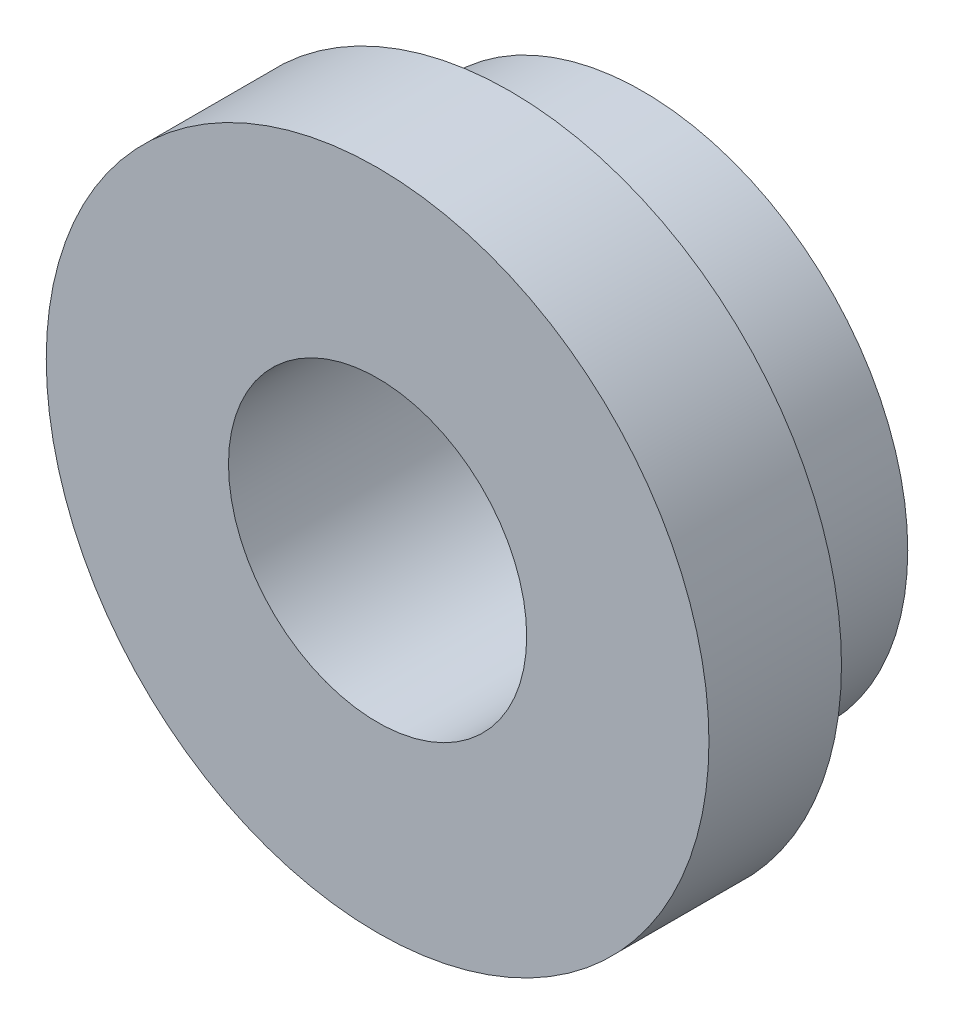
ISO-10303-21;
HEADER;
FILE_DESCRIPTION(('STEP AP214'),'2;1');
FILE_NAME('part.step','',(''),(''),'','','');
FILE_SCHEMA(('AUTOMOTIVE_DESIGN { 1 0 10303 214 1 1 1 1 }'));
ENDSEC;
DATA;
#1=APPLICATION_CONTEXT('core data for automotive mechanical design processes');
#2=APPLICATION_PROTOCOL_DEFINITION('international standard','automotive_design',2000,#1);
#3=PRODUCT_CONTEXT('',#1,'mechanical');
#4=PRODUCT('Part','Part','',(#3));
#5=PRODUCT_RELATED_PRODUCT_CATEGORY('part','',(#4));
#6=PRODUCT_DEFINITION_FORMATION('','',#4);
#7=PRODUCT_DEFINITION_CONTEXT('part definition',#1,'design');
#8=PRODUCT_DEFINITION('design','',#6,#7);
#9=PRODUCT_DEFINITION_SHAPE('','',#8);
#10=(LENGTH_UNIT() NAMED_UNIT(*) SI_UNIT(.MILLI.,.METRE.));
#11=(NAMED_UNIT(*) PLANE_ANGLE_UNIT() SI_UNIT($,.RADIAN.));
#12=(NAMED_UNIT(*) SI_UNIT($,.STERADIAN.) SOLID_ANGLE_UNIT());
#13=UNCERTAINTY_MEASURE_WITH_UNIT(LENGTH_MEASURE(1.E-05),#10,'distance_accuracy_value','');
#14=(GEOMETRIC_REPRESENTATION_CONTEXT(3) GLOBAL_UNCERTAINTY_ASSIGNED_CONTEXT((#13)) GLOBAL_UNIT_ASSIGNED_CONTEXT((#10,
#11,#12)) REPRESENTATION_CONTEXT('',''));
#15=CARTESIAN_POINT('',(0.,0.,0.));
#16=DIRECTION('',(0.,0.,1.));
#17=DIRECTION('',(1.,0.,0.));
#18=AXIS2_PLACEMENT_3D('',#15,#16,#17);
#19=CARTESIAN_POINT('',(0.,0.,0.));
#20=DIRECTION('',(0.,0.,1.));
#21=DIRECTION('',(1.,0.,0.));
#22=AXIS2_PLACEMENT_3D('',#19,#20,#21);
#23=PLANE('',#22);
#24=CARTESIAN_POINT('',(0.,0.,0.));
#25=DIRECTION('',(0.,0.,1.));
#26=DIRECTION('',(1.,0.,0.));
#27=AXIS2_PLACEMENT_3D('',#24,#25,#26);
#28=CIRCLE('',#27,4.);
#29=CARTESIAN_POINT('',(-4.,0.,0.));
#30=VERTEX_POINT('',#29);
#31=EDGE_CURVE('E34',#30,#30,#28,.T.);
#32=ORIENTED_EDGE('',*,*,#31,.F.);
#33=EDGE_LOOP('',(#32));
#34=FACE_BOUND('',#33,.T.);
#35=CARTESIAN_POINT('',(0.,0.,0.));
#36=DIRECTION('',(0.,0.,1.));
#37=DIRECTION('',(1.,0.,0.));
#38=AXIS2_PLACEMENT_3D('',#35,#36,#37);
#39=CIRCLE('',#38,2.25);
#40=CARTESIAN_POINT('',(-2.25,0.,0.));
#41=VERTEX_POINT('',#40);
#42=EDGE_CURVE('E41',#41,#41,#39,.T.);
#43=ORIENTED_EDGE('',*,*,#42,.T.);
#44=EDGE_LOOP('',(#43));
#45=FACE_BOUND('',#44,.T.);
#46=ADVANCED_FACE('F30',(#34,#45),#23,.F.);
#47=CARTESIAN_POINT('',(0.,0.,2.));
#48=DIRECTION('',(0.,0.,-1.));
#49=DIRECTION('',(-1.,0.,0.));
#50=AXIS2_PLACEMENT_3D('',#47,#48,#49);
#51=CYLINDRICAL_SURFACE('',#50,4.);
#52=CARTESIAN_POINT('',(0.,0.,2.));
#53=DIRECTION('',(0.,0.,1.));
#54=DIRECTION('',(1.,0.,0.));
#55=AXIS2_PLACEMENT_3D('',#52,#53,#54);
#56=CIRCLE('',#55,4.);
#57=CARTESIAN_POINT('',(-4.,0.,2.));
#58=VERTEX_POINT('',#57);
#59=EDGE_CURVE('E10',#58,#58,#56,.T.);
#60=CARTESIAN_POINT('',(-4.,0.,2.));
#61=CARTESIAN_POINT('',(-4.,0.,1.97916666666667));
#62=CARTESIAN_POINT('',(-4.,0.,1.95833333333334));
#63=CARTESIAN_POINT('',(-4.,0.,1.91666666666667));
#64=CARTESIAN_POINT('',(-4.,0.,1.89583333333334));
#65=CARTESIAN_POINT('',(-4.,0.,1.85416666666667));
#66=CARTESIAN_POINT('',(-4.,0.,1.83333333333334));
#67=CARTESIAN_POINT('',(-4.,0.,1.79166666666667));
#68=CARTESIAN_POINT('',(-4.,0.,1.77083333333334));
#69=CARTESIAN_POINT('',(-4.,0.,1.72916666666667));
#70=CARTESIAN_POINT('',(-4.,0.,1.70833333333334));
#71=CARTESIAN_POINT('',(-4.,0.,1.66666666666667));
#72=CARTESIAN_POINT('',(-4.,0.,1.64583333333334));
#73=CARTESIAN_POINT('',(-4.,0.,1.60416666666667));
#74=CARTESIAN_POINT('',(-4.,0.,1.58333333333334));
#75=CARTESIAN_POINT('',(-4.,0.,1.54166666666667));
#76=CARTESIAN_POINT('',(-4.,0.,1.52083333333334));
#77=CARTESIAN_POINT('',(-4.,0.,1.47916666666667));
#78=CARTESIAN_POINT('',(-4.,0.,1.45833333333333));
#79=CARTESIAN_POINT('',(-4.,0.,1.41666666666667));
#80=CARTESIAN_POINT('',(-4.,0.,1.39583333333333));
#81=CARTESIAN_POINT('',(-4.,0.,1.35416666666667));
#82=CARTESIAN_POINT('',(-4.,0.,1.33333333333333));
#83=CARTESIAN_POINT('',(-4.,0.,1.29166666666667));
#84=CARTESIAN_POINT('',(-4.,0.,1.27083333333333));
#85=CARTESIAN_POINT('',(-4.,0.,1.22916666666667));
#86=CARTESIAN_POINT('',(-4.,0.,1.20833333333333));
#87=CARTESIAN_POINT('',(-4.,0.,1.16666666666667));
#88=CARTESIAN_POINT('',(-4.,0.,1.14583333333333));
#89=CARTESIAN_POINT('',(-4.,0.,1.10416666666667));
#90=CARTESIAN_POINT('',(-4.,0.,1.08333333333333));
#91=CARTESIAN_POINT('',(-4.,0.,1.04166666666667));
#92=CARTESIAN_POINT('',(-4.,0.,1.02083333333333));
#93=CARTESIAN_POINT('',(-4.,0.,0.979166666666668));
#94=CARTESIAN_POINT('',(-4.,0.,0.958333333333334));
#95=CARTESIAN_POINT('',(-4.,0.,0.916666666666668));
#96=CARTESIAN_POINT('',(-4.,0.,0.895833333333334));
#97=CARTESIAN_POINT('',(-4.,0.,0.854166666666668));
#98=CARTESIAN_POINT('',(-4.,0.,0.833333333333334));
#99=CARTESIAN_POINT('',(-4.,0.,0.791666666666668));
#100=CARTESIAN_POINT('',(-4.,0.,0.770833333333334));
#101=CARTESIAN_POINT('',(-4.,0.,0.729166666666668));
#102=CARTESIAN_POINT('',(-4.,0.,0.708333333333334));
#103=CARTESIAN_POINT('',(-4.,0.,0.666666666666668));
#104=CARTESIAN_POINT('',(-4.,0.,0.645833333333334));
#105=CARTESIAN_POINT('',(-4.,0.,0.604166666666667));
#106=CARTESIAN_POINT('',(-4.,0.,0.583333333333334));
#107=CARTESIAN_POINT('',(-4.,0.,0.541666666666667));
#108=CARTESIAN_POINT('',(-4.,0.,0.520833333333334));
#109=CARTESIAN_POINT('',(-4.,0.,0.479166666666667));
#110=CARTESIAN_POINT('',(-4.,0.,0.458333333333334));
#111=CARTESIAN_POINT('',(-4.,0.,0.416666666666667));
#112=CARTESIAN_POINT('',(-4.,0.,0.395833333333334));
#113=CARTESIAN_POINT('',(-4.,0.,0.354166666666667));
#114=CARTESIAN_POINT('',(-4.,0.,0.333333333333334));
#115=CARTESIAN_POINT('',(-4.,0.,0.291666666666667));
#116=CARTESIAN_POINT('',(-4.,0.,0.270833333333334));
#117=CARTESIAN_POINT('',(-4.,0.,0.229166666666667));
#118=CARTESIAN_POINT('',(-4.,0.,0.208333333333334));
#119=CARTESIAN_POINT('',(-4.,0.,0.166666666666667));
#120=CARTESIAN_POINT('',(-4.,0.,0.145833333333334));
#121=CARTESIAN_POINT('',(-4.,0.,0.104166666666667));
#122=CARTESIAN_POINT('',(-4.,0.,0.0833333333333336));
#123=CARTESIAN_POINT('',(-4.,0.,0.0416666666666669));
#124=CARTESIAN_POINT('',(-4.,0.,0.0208333333333334));
#125=CARTESIAN_POINT('',(-4.,0.,0.));
#126=B_SPLINE_CURVE_WITH_KNOTS('',3,(#60,#61,#62,#63,#64,#65,#66,#67,#68,#69,#70,#71,#72,#73,
#74,#75,#76,#77,#78,#79,#80,#81,#82,#83,#84,#85,#86,#87,#88,#89,#90,#91,#92,#93,#94,#95,#96,#97,
#98,#99,#100,#101,#102,#103,#104,#105,#106,#107,#108,#109,#110,#111,#112,#113,#114,#115,#116,
#117,#118,#119,#120,#121,#122,#123,#124,#125),.UNSPECIFIED.,.F.,.F.,(4,2,2,2,2,2,2,2,2,2,2,2,2,
2,2,2,2,2,2,2,2,2,2,2,2,2,2,2,2,2,2,2,4),(0.,0.0624999999999998,0.125,0.1875,0.25,0.3125,0.375,
0.4375,0.5,0.5625,0.625,0.6875,0.75,0.812500000000001,0.875000000000001,0.937500000000001,1.,
1.0625,1.125,1.1875,1.25,1.3125,1.375,1.4375,1.5,1.5625,1.625,1.6875,1.75,1.8125,1.875,1.9375,
2.),.UNSPECIFIED.);
#127=EDGE_CURVE('BSEAM32',#58,#30,#126,.T.);
#128=ORIENTED_EDGE('',*,*,#59,.F.);
#129=ORIENTED_EDGE('',*,*,#31,.T.);
#130=ORIENTED_EDGE('',*,*,#127,.T.);
#131=ORIENTED_EDGE('',*,*,#127,.F.);
#132=EDGE_LOOP('',(#128,#130,#129,#131));
#133=FACE_BOUND('',#132,.T.);
#134=ADVANCED_FACE('F32',(#133),#51,.T.);
#135=CARTESIAN_POINT('',(0.,0.,2.));
#136=DIRECTION('',(0.,0.,-1.));
#137=DIRECTION('',(-1.,0.,0.));
#138=AXIS2_PLACEMENT_3D('',#135,#136,#137);
#139=CYLINDRICAL_SURFACE('',#138,2.25);
#140=CARTESIAN_POINT('',(0.,-1.11022302462516E-13,4.));
#141=DIRECTION('',(0.,0.,1.));
#142=DIRECTION('',(1.,0.,0.));
#143=AXIS2_PLACEMENT_3D('',#140,#141,#142);
#144=CIRCLE('',#143,2.25);
#145=CARTESIAN_POINT('',(-2.25,0.,4.));
#146=VERTEX_POINT('',#145);
#147=EDGE_CURVE('E49',#146,#146,#144,.T.);
#148=CARTESIAN_POINT('',(-2.25,0.,0.));
#149=CARTESIAN_POINT('',(-2.25,0.,0.0416666666666667));
#150=CARTESIAN_POINT('',(-2.25,0.,0.0833333333333334));
#151=CARTESIAN_POINT('',(-2.25,0.,0.166666666666667));
#152=CARTESIAN_POINT('',(-2.25,0.,0.208333333333334));
#153=CARTESIAN_POINT('',(-2.25,0.,0.291666666666667));
#154=CARTESIAN_POINT('',(-2.25,0.,0.333333333333333));
#155=CARTESIAN_POINT('',(-2.25,0.,0.416666666666667));
#156=CARTESIAN_POINT('',(-2.25,0.,0.458333333333334));
#157=CARTESIAN_POINT('',(-2.25,0.,0.541666666666667));
#158=CARTESIAN_POINT('',(-2.25,0.,0.583333333333334));
#159=CARTESIAN_POINT('',(-2.25,0.,0.666666666666667));
#160=CARTESIAN_POINT('',(-2.25,0.,0.708333333333334));
#161=CARTESIAN_POINT('',(-2.25,0.,0.791666666666667));
#162=CARTESIAN_POINT('',(-2.25,0.,0.833333333333334));
#163=CARTESIAN_POINT('',(-2.25,0.,0.916666666666667));
#164=CARTESIAN_POINT('',(-2.25,0.,0.958333333333334));
#165=CARTESIAN_POINT('',(-2.25,0.,1.04166666666667));
#166=CARTESIAN_POINT('',(-2.25,0.,1.08333333333333));
#167=CARTESIAN_POINT('',(-2.25,0.,1.16666666666667));
#168=CARTESIAN_POINT('',(-2.25,0.,1.20833333333333));
#169=CARTESIAN_POINT('',(-2.25,0.,1.29166666666667));
#170=CARTESIAN_POINT('',(-2.25,0.,1.33333333333333));
#171=CARTESIAN_POINT('',(-2.25,0.,1.41666666666667));
#172=CARTESIAN_POINT('',(-2.25,0.,1.45833333333333));
#173=CARTESIAN_POINT('',(-2.25,0.,1.54166666666667));
#174=CARTESIAN_POINT('',(-2.25,0.,1.58333333333333));
#175=CARTESIAN_POINT('',(-2.25,0.,1.66666666666667));
#176=CARTESIAN_POINT('',(-2.25,0.,1.70833333333333));
#177=CARTESIAN_POINT('',(-2.25,0.,1.79166666666667));
#178=CARTESIAN_POINT('',(-2.25,0.,1.83333333333333));
#179=CARTESIAN_POINT('',(-2.25,0.,1.91666666666667));
#180=CARTESIAN_POINT('',(-2.25,0.,1.95833333333333));
#181=CARTESIAN_POINT('',(-2.25,0.,2.04166666666667));
#182=CARTESIAN_POINT('',(-2.25,0.,2.08333333333333));
#183=CARTESIAN_POINT('',(-2.25,0.,2.16666666666667));
#184=CARTESIAN_POINT('',(-2.25,0.,2.20833333333333));
#185=CARTESIAN_POINT('',(-2.25,0.,2.29166666666667));
#186=CARTESIAN_POINT('',(-2.25,0.,2.33333333333333));
#187=CARTESIAN_POINT('',(-2.25,0.,2.41666666666667));
#188=CARTESIAN_POINT('',(-2.25,0.,2.45833333333333));
#189=CARTESIAN_POINT('',(-2.25,0.,2.54166666666667));
#190=CARTESIAN_POINT('',(-2.25,0.,2.58333333333333));
#191=CARTESIAN_POINT('',(-2.25,0.,2.66666666666667));
#192=CARTESIAN_POINT('',(-2.25,0.,2.70833333333333));
#193=CARTESIAN_POINT('',(-2.25,0.,2.79166666666667));
#194=CARTESIAN_POINT('',(-2.25,0.,2.83333333333333));
#195=CARTESIAN_POINT('',(-2.25,0.,2.91666666666667));
#196=CARTESIAN_POINT('',(-2.25,0.,2.95833333333334));
#197=CARTESIAN_POINT('',(-2.25,0.,3.04166666666667));
#198=CARTESIAN_POINT('',(-2.25,0.,3.08333333333334));
#199=CARTESIAN_POINT('',(-2.25,0.,3.16666666666667));
#200=CARTESIAN_POINT('',(-2.25,0.,3.20833333333334));
#201=CARTESIAN_POINT('',(-2.25,0.,3.29166666666667));
#202=CARTESIAN_POINT('',(-2.25,0.,3.33333333333334));
#203=CARTESIAN_POINT('',(-2.25,0.,3.41666666666667));
#204=CARTESIAN_POINT('',(-2.25,0.,3.45833333333334));
#205=CARTESIAN_POINT('',(-2.25,0.,3.54166666666667));
#206=CARTESIAN_POINT('',(-2.25,0.,3.58333333333334));
#207=CARTESIAN_POINT('',(-2.25,0.,3.66666666666667));
#208=CARTESIAN_POINT('',(-2.25,0.,3.70833333333334));
#209=CARTESIAN_POINT('',(-2.25,0.,3.79166666666667));
#210=CARTESIAN_POINT('',(-2.25,0.,3.83333333333334));
#211=CARTESIAN_POINT('',(-2.25,0.,3.91666666666667));
#212=CARTESIAN_POINT('',(-2.25,0.,3.95833333333334));
#213=CARTESIAN_POINT('',(-2.25,0.,4.));
#214=B_SPLINE_CURVE_WITH_KNOTS('',3,(#148,#149,#150,#151,#152,#153,#154,#155,#156,#157,#158,
#159,#160,#161,#162,#163,#164,#165,#166,#167,#168,#169,#170,#171,#172,#173,#174,#175,#176,#177,
#178,#179,#180,#181,#182,#183,#184,#185,#186,#187,#188,#189,#190,#191,#192,#193,#194,#195,#196,
#197,#198,#199,#200,#201,#202,#203,#204,#205,#206,#207,#208,#209,#210,#211,#212,#213),
.UNSPECIFIED.,.F.,.F.,(4,2,2,2,2,2,2,2,2,2,2,2,2,2,2,2,2,2,2,2,2,2,2,2,2,2,2,2,2,2,2,2,4),(0.,
0.125,0.25,0.375,0.5,0.625,0.750000000000001,0.875000000000001,1.,1.125,1.25,1.375,1.5,1.625,
1.75,1.875,2.,2.125,2.25,2.375,2.5,2.625,2.75,2.875,3.,3.125,3.25,3.375,3.5,3.625,3.75,3.875,
4.),.UNSPECIFIED.);
#215=EDGE_CURVE('BSEAM55',#41,#146,#214,.T.);
#216=ORIENTED_EDGE('',*,*,#42,.F.);
#217=ORIENTED_EDGE('',*,*,#147,.T.);
#218=ORIENTED_EDGE('',*,*,#215,.T.);
#219=ORIENTED_EDGE('',*,*,#215,.F.);
#220=EDGE_LOOP('',(#216,#218,#217,#219));
#221=FACE_BOUND('',#220,.T.);
#222=ADVANCED_FACE('F55',(#221),#139,.F.);
#223=CARTESIAN_POINT('',(0.,-1.11022302462516E-13,4.));
#224=DIRECTION('',(0.,0.,1.));
#225=DIRECTION('',(1.,0.,0.));
#226=AXIS2_PLACEMENT_3D('',#223,#224,#225);
#227=PLANE('',#226);
#228=CARTESIAN_POINT('',(0.,-1.11022302462516E-13,4.));
#229=DIRECTION('',(0.,0.,1.));
#230=DIRECTION('',(1.,0.,0.));
#231=AXIS2_PLACEMENT_3D('',#228,#229,#230);
#232=CIRCLE('',#231,5.);
#233=CARTESIAN_POINT('',(-5.,-1.1296519275561E-13,4.));
#234=VERTEX_POINT('',#233);
#235=EDGE_CURVE('E45',#234,#234,#232,.T.);
#236=ORIENTED_EDGE('',*,*,#235,.T.);
#237=EDGE_LOOP('',(#236));
#238=FACE_BOUND('',#237,.T.);
#239=ORIENTED_EDGE('',*,*,#147,.F.);
#240=EDGE_LOOP('',(#239));
#241=FACE_BOUND('',#240,.T.);
#242=ADVANCED_FACE('F57',(#238,#241),#227,.T.);
#243=CARTESIAN_POINT('',(0.,0.,2.));
#244=DIRECTION('',(0.,0.,1.));
#245=DIRECTION('',(1.,0.,0.));
#246=AXIS2_PLACEMENT_3D('',#243,#244,#245);
#247=PLANE('',#246);
#248=ORIENTED_EDGE('',*,*,#59,.T.);
#249=EDGE_LOOP('',(#248));
#250=FACE_BOUND('',#249,.T.);
#251=CARTESIAN_POINT('',(0.,0.,2.));
#252=DIRECTION('',(0.,0.,1.));
#253=DIRECTION('',(1.,0.,0.));
#254=AXIS2_PLACEMENT_3D('',#251,#252,#253);
#255=CIRCLE('',#254,5.);
#256=CARTESIAN_POINT('',(-5.,-1.1296519275561E-13,2.));
#257=VERTEX_POINT('',#256);
#258=EDGE_CURVE('E46',#257,#257,#255,.T.);
#259=ORIENTED_EDGE('',*,*,#258,.F.);
#260=EDGE_LOOP('',(#259));
#261=FACE_BOUND('',#260,.T.);
#262=ADVANCED_FACE('F59',(#250,#261),#247,.F.);
#263=CARTESIAN_POINT('',(0.,-1.11022302462516E-13,4.));
#264=DIRECTION('',(0.,0.,-1.));
#265=DIRECTION('',(-1.,0.,0.));
#266=AXIS2_PLACEMENT_3D('',#263,#264,#265);
#267=CYLINDRICAL_SURFACE('',#266,5.);
#268=CARTESIAN_POINT('',(-5.,-1.1296519275561E-13,4.));
#269=CARTESIAN_POINT('',(-5.,-1.1296519275561E-13,3.97916666666667));
#270=CARTESIAN_POINT('',(-5.,-1.1296519275561E-13,3.95833333333334));
#271=CARTESIAN_POINT('',(-5.,-1.1296519275561E-13,3.91666666666667));
#272=CARTESIAN_POINT('',(-5.,-1.1296519275561E-13,3.89583333333334));
#273=CARTESIAN_POINT('',(-5.,-1.1296519275561E-13,3.85416666666667));
#274=CARTESIAN_POINT('',(-5.,-1.1296519275561E-13,3.83333333333334));
#275=CARTESIAN_POINT('',(-5.,-1.1296519275561E-13,3.79166666666667));
#276=CARTESIAN_POINT('',(-5.,-1.1296519275561E-13,3.77083333333334));
#277=CARTESIAN_POINT('',(-5.,-1.1296519275561E-13,3.72916666666667));
#278=CARTESIAN_POINT('',(-5.,-1.1296519275561E-13,3.70833333333334));
#279=CARTESIAN_POINT('',(-5.,-1.1296519275561E-13,3.66666666666667));
#280=CARTESIAN_POINT('',(-5.,-1.1296519275561E-13,3.64583333333334));
#281=CARTESIAN_POINT('',(-5.,-1.1296519275561E-13,3.60416666666667));
#282=CARTESIAN_POINT('',(-5.,-1.1296519275561E-13,3.58333333333334));
#283=CARTESIAN_POINT('',(-5.,-1.1296519275561E-13,3.54166666666667));
#284=CARTESIAN_POINT('',(-5.,-1.1296519275561E-13,3.52083333333334));
#285=CARTESIAN_POINT('',(-5.,-1.1296519275561E-13,3.47916666666667));
#286=CARTESIAN_POINT('',(-5.,-1.1296519275561E-13,3.45833333333334));
#287=CARTESIAN_POINT('',(-5.,-1.1296519275561E-13,3.41666666666667));
#288=CARTESIAN_POINT('',(-5.,-1.1296519275561E-13,3.39583333333334));
#289=CARTESIAN_POINT('',(-5.,-1.1296519275561E-13,3.35416666666667));
#290=CARTESIAN_POINT('',(-5.,-1.1296519275561E-13,3.33333333333334));
#291=CARTESIAN_POINT('',(-5.,-1.1296519275561E-13,3.29166666666667));
#292=CARTESIAN_POINT('',(-5.,-1.1296519275561E-13,3.27083333333334));
#293=CARTESIAN_POINT('',(-5.,-1.1296519275561E-13,3.22916666666667));
#294=CARTESIAN_POINT('',(-5.,-1.1296519275561E-13,3.20833333333334));
#295=CARTESIAN_POINT('',(-5.,-1.1296519275561E-13,3.16666666666667));
#296=CARTESIAN_POINT('',(-5.,-1.1296519275561E-13,3.14583333333334));
#297=CARTESIAN_POINT('',(-5.,-1.1296519275561E-13,3.10416666666667));
#298=CARTESIAN_POINT('',(-5.,-1.1296519275561E-13,3.08333333333334));
#299=CARTESIAN_POINT('',(-5.,-1.1296519275561E-13,3.04166666666667));
#300=CARTESIAN_POINT('',(-5.,-1.1296519275561E-13,3.02083333333334));
#301=CARTESIAN_POINT('',(-5.,-1.1296519275561E-13,2.97916666666667));
#302=CARTESIAN_POINT('',(-5.,-1.1296519275561E-13,2.95833333333334));
#303=CARTESIAN_POINT('',(-5.,-1.1296519275561E-13,2.91666666666667));
#304=CARTESIAN_POINT('',(-5.,-1.1296519275561E-13,2.89583333333334));
#305=CARTESIAN_POINT('',(-5.,-1.1296519275561E-13,2.85416666666667));
#306=CARTESIAN_POINT('',(-5.,-1.1296519275561E-13,2.83333333333334));
#307=CARTESIAN_POINT('',(-5.,-1.1296519275561E-13,2.79166666666667));
#308=CARTESIAN_POINT('',(-5.,-1.1296519275561E-13,2.77083333333334));
#309=CARTESIAN_POINT('',(-5.,-1.1296519275561E-13,2.72916666666667));
#310=CARTESIAN_POINT('',(-5.,-1.1296519275561E-13,2.70833333333334));
#311=CARTESIAN_POINT('',(-5.,-1.1296519275561E-13,2.66666666666667));
#312=CARTESIAN_POINT('',(-5.,-1.1296519275561E-13,2.64583333333334));
#313=CARTESIAN_POINT('',(-5.,-1.1296519275561E-13,2.60416666666667));
#314=CARTESIAN_POINT('',(-5.,-1.1296519275561E-13,2.58333333333334));
#315=CARTESIAN_POINT('',(-5.,-1.1296519275561E-13,2.54166666666667));
#316=CARTESIAN_POINT('',(-5.,-1.1296519275561E-13,2.52083333333334));
#317=CARTESIAN_POINT('',(-5.,-1.1296519275561E-13,2.47916666666667));
#318=CARTESIAN_POINT('',(-5.,-1.1296519275561E-13,2.45833333333334));
#319=CARTESIAN_POINT('',(-5.,-1.1296519275561E-13,2.41666666666667));
#320=CARTESIAN_POINT('',(-5.,-1.1296519275561E-13,2.39583333333334));
#321=CARTESIAN_POINT('',(-5.,-1.1296519275561E-13,2.35416666666667));
#322=CARTESIAN_POINT('',(-5.,-1.1296519275561E-13,2.33333333333334));
#323=CARTESIAN_POINT('',(-5.,-1.1296519275561E-13,2.29166666666667));
#324=CARTESIAN_POINT('',(-5.,-1.1296519275561E-13,2.27083333333334));
#325=CARTESIAN_POINT('',(-5.,-1.1296519275561E-13,2.22916666666667));
#326=CARTESIAN_POINT('',(-5.,-1.1296519275561E-13,2.20833333333334));
#327=CARTESIAN_POINT('',(-5.,-1.1296519275561E-13,2.16666666666667));
#328=CARTESIAN_POINT('',(-5.,-1.1296519275561E-13,2.14583333333334));
#329=CARTESIAN_POINT('',(-5.,-1.1296519275561E-13,2.10416666666667));
#330=CARTESIAN_POINT('',(-5.,-1.1296519275561E-13,2.08333333333334));
#331=CARTESIAN_POINT('',(-5.,-1.1296519275561E-13,2.04166666666667));
#332=CARTESIAN_POINT('',(-5.,-1.1296519275561E-13,2.02083333333333));
#333=CARTESIAN_POINT('',(-5.,-1.1296519275561E-13,2.));
#334=B_SPLINE_CURVE_WITH_KNOTS('',3,(#268,#269,#270,#271,#272,#273,#274,#275,#276,#277,#278,
#279,#280,#281,#282,#283,#284,#285,#286,#287,#288,#289,#290,#291,#292,#293,#294,#295,#296,#297,
#298,#299,#300,#301,#302,#303,#304,#305,#306,#307,#308,#309,#310,#311,#312,#313,#314,#315,#316,
#317,#318,#319,#320,#321,#322,#323,#324,#325,#326,#327,#328,#329,#330,#331,#332,#333),
.UNSPECIFIED.,.F.,.F.,(4,2,2,2,2,2,2,2,2,2,2,2,2,2,2,2,2,2,2,2,2,2,2,2,2,2,2,2,2,2,2,2,4),(0.,
0.0625000000000001,0.125,0.1875,0.25,0.3125,0.375,0.4375,0.5,0.5625,0.625,0.6875,0.75,
0.812500000000001,0.875,0.937500000000001,1.,1.0625,1.125,1.1875,1.25,1.3125,1.375,1.4375,1.5,
1.5625,1.625,1.6875,1.75,1.8125,1.875,1.9375,2.),.UNSPECIFIED.);
#335=EDGE_CURVE('BSEAM66',#234,#257,#334,.T.);
#336=ORIENTED_EDGE('',*,*,#235,.F.);
#337=ORIENTED_EDGE('',*,*,#258,.T.);
#338=ORIENTED_EDGE('',*,*,#335,.T.);
#339=ORIENTED_EDGE('',*,*,#335,.F.);
#340=EDGE_LOOP('',(#336,#338,#337,#339));
#341=FACE_BOUND('',#340,.T.);
#342=ADVANCED_FACE('F66',(#341),#267,.T.);
#343=CLOSED_SHELL('',(#46,#134,#222,#242,#262,#342));
#344=MANIFOLD_SOLID_BREP('B2',#343);
#345=ADVANCED_BREP_SHAPE_REPRESENTATION('',(#18,#344),#14);
#346=SHAPE_DEFINITION_REPRESENTATION(#9,#345);
ENDSEC;
END-ISO-10303-21;
